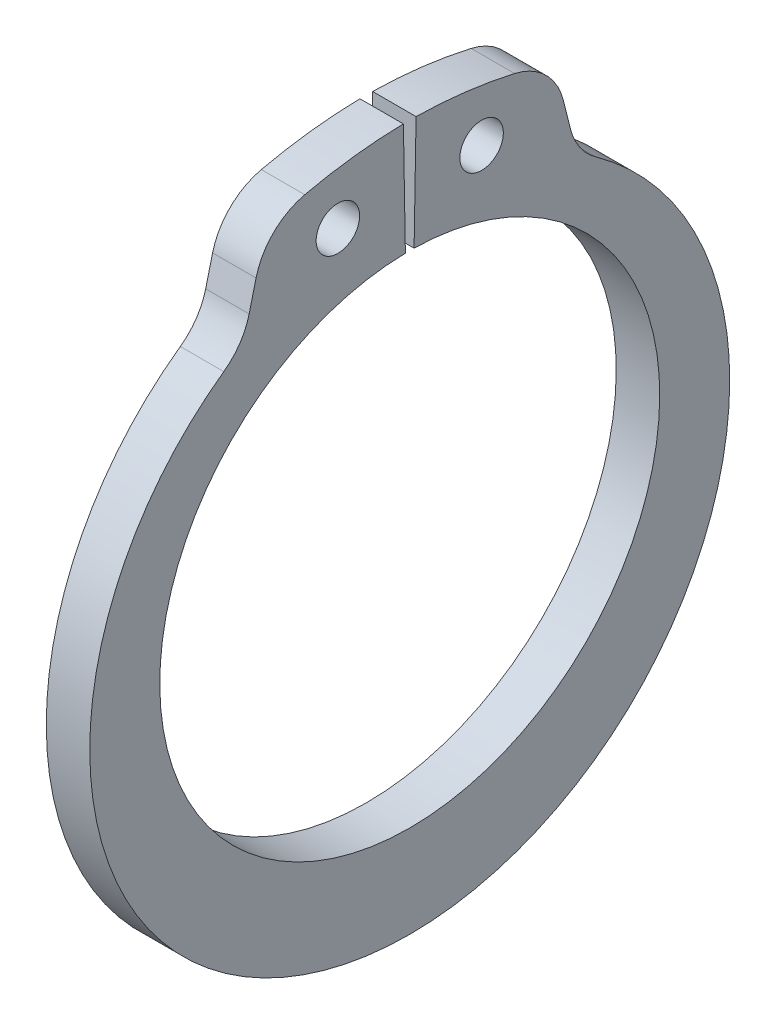
ISO-10303-21;
HEADER;
FILE_DESCRIPTION(('STEP AP214'),'2;1');
FILE_NAME('part.step','',(''),(''),'','','');
FILE_SCHEMA(('AUTOMOTIVE_DESIGN { 1 0 10303 214 1 1 1 1 }'));
ENDSEC;
DATA;
#1=APPLICATION_CONTEXT('core data for automotive mechanical design processes');
#2=APPLICATION_PROTOCOL_DEFINITION('international standard','automotive_design',2000,#1);
#3=PRODUCT_CONTEXT('',#1,'mechanical');
#4=PRODUCT('Part','Part','',(#3));
#5=PRODUCT_RELATED_PRODUCT_CATEGORY('part','',(#4));
#6=PRODUCT_DEFINITION_FORMATION('','',#4);
#7=PRODUCT_DEFINITION_CONTEXT('part definition',#1,'design');
#8=PRODUCT_DEFINITION('design','',#6,#7);
#9=PRODUCT_DEFINITION_SHAPE('','',#8);
#10=(LENGTH_UNIT() NAMED_UNIT(*) SI_UNIT(.MILLI.,.METRE.));
#11=(NAMED_UNIT(*) PLANE_ANGLE_UNIT() SI_UNIT($,.RADIAN.));
#12=(NAMED_UNIT(*) SI_UNIT($,.STERADIAN.) SOLID_ANGLE_UNIT());
#13=UNCERTAINTY_MEASURE_WITH_UNIT(LENGTH_MEASURE(1.E-05),#10,'distance_accuracy_value','');
#14=(GEOMETRIC_REPRESENTATION_CONTEXT(3) GLOBAL_UNCERTAINTY_ASSIGNED_CONTEXT((#13)) GLOBAL_UNIT_ASSIGNED_CONTEXT((#10,
#11,#12)) REPRESENTATION_CONTEXT('',''));
#15=CARTESIAN_POINT('',(0.,0.,0.));
#16=DIRECTION('',(0.,0.,1.));
#17=DIRECTION('',(1.,0.,0.));
#18=AXIS2_PLACEMENT_3D('',#15,#16,#17);
#19=CARTESIAN_POINT('',(0.635,0.,0.));
#20=DIRECTION('',(1.,0.,0.));
#21=DIRECTION('',(0.,0.,-1.));
#22=AXIS2_PLACEMENT_3D('',#19,#20,#21);
#23=PLANE('',#22);
#24=CARTESIAN_POINT('',(0.635,8.91822312671087,2.09914672795182));
#25=DIRECTION('',(1.,0.,0.));
#26=DIRECTION('',(0.,0.,-1.));
#27=AXIS2_PLACEMENT_3D('',#24,#25,#26);
#28=CIRCLE('',#27,0.635);
#29=CARTESIAN_POINT('',(0.635,8.91822312671087,1.46414672795182));
#30=VERTEX_POINT('',#29);
#31=EDGE_CURVE('E219',#30,#30,#28,.T.);
#32=ORIENTED_EDGE('',*,*,#31,.F.);
#33=EDGE_LOOP('',(#32));
#34=FACE_BOUND('',#33,.T.);
#35=CARTESIAN_POINT('',(0.635,-3.4166642590157,-0.0596380964790399));
#36=DIRECTION('',(1.,0.,0.));
#37=DIRECTION('',(0.,0.,-1.));
#38=AXIS2_PLACEMENT_3D('',#35,#36,#37);
#39=CIRCLE('',#38,14.021684712799);
#40=CARTESIAN_POINT('',(0.635,10.6028848832859,0.185074044064174));
#41=VERTEX_POINT('',#40);
#42=CARTESIAN_POINT('',(0.635,10.2522844995259,3.06565901283796));
#43=VERTEX_POINT('',#42);
#44=EDGE_CURVE('E136',#41,#43,#39,.T.);
#45=ORIENTED_EDGE('',*,*,#44,.T.);
#46=CARTESIAN_POINT('',(0.635,8.39520755632137,2.64105304606605));
#47=DIRECTION('',(1.,0.,0.));
#48=DIRECTION('',(0.,0.,-1.));
#49=AXIS2_PLACEMENT_3D('',#46,#47,#48);
#50=CIRCLE('',#49,1.905);
#51=CARTESIAN_POINT('',(0.635,8.85606876743873,4.48946640462183));
#52=VERTEX_POINT('',#51);
#53=EDGE_CURVE('E173',#43,#52,#50,.T.);
#54=ORIENTED_EDGE('',*,*,#53,.T.);
#55=DIRECTION('',(0.,-0.970295726275997,0.241921895599664));
#56=VECTOR('',#55,1.);
#57=CARTESIAN_POINT('',(0.635,9.93587406191388,4.22024070709085));
#58=LINE('',#57,#56);
#59=CARTESIAN_POINT('',(0.635,8.04884426110369,4.69073007863241));
#60=VERTEX_POINT('',#59);
#61=EDGE_CURVE('E211',#52,#60,#58,.T.);
#62=ORIENTED_EDGE('',*,*,#61,.T.);
#63=CARTESIAN_POINT('',(0.635,8.50970547222105,6.53914343718819));
#64=DIRECTION('',(1.,0.,0.));
#65=DIRECTION('',(0.,0.,-1.));
#66=AXIS2_PLACEMENT_3D('',#63,#64,#65);
#67=CIRCLE('',#66,1.905);
#68=CARTESIAN_POINT('',(0.635,6.9594033093494,5.43208056463059));
#69=VERTEX_POINT('',#68);
#70=EDGE_CURVE('E184',#60,#69,#67,.F.);
#71=ORIENTED_EDGE('',*,*,#70,.T.);
#72=CARTESIAN_POINT('',(0.635,-0.647541568843794,0.));
#73=DIRECTION('',(1.,0.,0.));
#74=DIRECTION('',(0.,0.,-1.));
#75=AXIS2_PLACEMENT_3D('',#72,#73,#74);
#76=CIRCLE('',#75,9.34735843115621);
#77=CARTESIAN_POINT('',(0.635,6.95940330934924,-5.4320805646308));
#78=VERTEX_POINT('',#77);
#79=EDGE_CURVE('E206',#69,#78,#76,.T.);
#80=ORIENTED_EDGE('',*,*,#79,.T.);
#81=CARTESIAN_POINT('',(0.635,8.50970547222087,-6.53914343718844));
#82=DIRECTION('',(1.,0.,0.));
#83=DIRECTION('',(0.,0.,-1.));
#84=AXIS2_PLACEMENT_3D('',#81,#82,#83);
#85=CIRCLE('',#84,1.905);
#86=CARTESIAN_POINT('',(0.635,8.0488442611033,-4.69073007863272));
#87=VERTEX_POINT('',#86);
#88=EDGE_CURVE('E11',#78,#87,#85,.F.);
#89=ORIENTED_EDGE('',*,*,#88,.T.);
#90=DIRECTION('',(0.,0.97029572627597,0.241921895599774));
#91=VECTOR('',#90,1.);
#92=CARTESIAN_POINT('',(0.635,9.9358740619139,-4.22024070709083));
#93=LINE('',#92,#91);
#94=CARTESIAN_POINT('',(0.635,8.85606876743885,-4.48946640462191));
#95=VERTEX_POINT('',#94);
#96=EDGE_CURVE('E205',#87,#95,#93,.T.);
#97=ORIENTED_EDGE('',*,*,#96,.T.);
#98=CARTESIAN_POINT('',(0.635,8.39520755632128,-2.64105304606619));
#99=DIRECTION('',(1.,0.,0.));
#100=DIRECTION('',(0.,0.,-1.));
#101=AXIS2_PLACEMENT_3D('',#98,#99,#100);
#102=CIRCLE('',#101,1.905);
#103=CARTESIAN_POINT('',(0.635,10.2522844995258,-3.06565901283805));
#104=VERTEX_POINT('',#103);
#105=EDGE_CURVE('E51',#95,#104,#102,.T.);
#106=ORIENTED_EDGE('',*,*,#105,.T.);
#107=CARTESIAN_POINT('',(0.635,-3.41666425902333,0.0596380964802941));
#108=DIRECTION('',(1.,0.,0.));
#109=DIRECTION('',(0.,0.,1.));
#110=AXIS2_PLACEMENT_3D('',#107,#108,#109);
#111=CIRCLE('',#110,14.0216847128066);
#112=CARTESIAN_POINT('',(0.635,10.6028848832859,-0.185074044064175));
#113=VERTEX_POINT('',#112);
#114=EDGE_CURVE('E208',#104,#113,#111,.T.);
#115=ORIENTED_EDGE('',*,*,#114,.T.);
#116=DIRECTION('',(0.,-0.999847695156391,0.0174524064372837));
#117=VECTOR('',#116,1.);
#118=CARTESIAN_POINT('',(0.635,10.6028848832859,-0.185074044064174));
#119=LINE('',#118,#117);
#120=CARTESIAN_POINT('',(0.635,7.30138779387956,-0.127446198008263));
#121=VERTEX_POINT('',#120);
#122=EDGE_CURVE('E142',#113,#121,#119,.T.);
#123=ORIENTED_EDGE('',*,*,#122,.T.);
#124=CARTESIAN_POINT('',(0.635,0.,0.));
#125=DIRECTION('',(-1.,0.,0.));
#126=DIRECTION('',(0.,0.,-1.));
#127=AXIS2_PLACEMENT_3D('',#124,#125,#126);
#128=CIRCLE('',#127,7.30250000000001);
#129=CARTESIAN_POINT('',(0.635,7.30138779387956,0.127446198008263));
#130=VERTEX_POINT('',#129);
#131=EDGE_CURVE('E137',#121,#130,#128,.T.);
#132=ORIENTED_EDGE('',*,*,#131,.T.);
#133=DIRECTION('',(0.,0.999847695156391,0.0174524064372837));
#134=VECTOR('',#133,1.);
#135=CARTESIAN_POINT('',(0.635,7.30138779387956,0.127446198008263));
#136=LINE('',#135,#134);
#137=EDGE_CURVE('E126',#130,#41,#136,.T.);
#138=ORIENTED_EDGE('',*,*,#137,.T.);
#139=EDGE_LOOP('',(#45,#54,#62,#71,#80,#89,#97,#106,#115,#123,#132,#138));
#140=FACE_BOUND('',#139,.T.);
#141=CARTESIAN_POINT('',(0.635,8.91822312671087,-2.09914672795182));
#142=DIRECTION('',(1.,0.,0.));
#143=DIRECTION('',(0.,0.,-1.));
#144=AXIS2_PLACEMENT_3D('',#141,#142,#143);
#145=CIRCLE('',#144,0.635);
#146=CARTESIAN_POINT('',(0.635,8.91822312671087,-2.73414672795182));
#147=VERTEX_POINT('',#146);
#148=EDGE_CURVE('E248',#147,#147,#145,.T.);
#149=ORIENTED_EDGE('',*,*,#148,.F.);
#150=EDGE_LOOP('',(#149));
#151=FACE_BOUND('',#150,.T.);
#152=ADVANCED_FACE('F36',(#34,#140,#151),#23,.T.);
#153=CARTESIAN_POINT('',(-0.635,0.,0.));
#154=DIRECTION('',(1.,0.,0.));
#155=DIRECTION('',(0.,0.,-1.));
#156=AXIS2_PLACEMENT_3D('',#153,#154,#155);
#157=PLANE('',#156);
#158=CARTESIAN_POINT('',(-0.635,8.91822312671087,2.09914672795182));
#159=DIRECTION('',(1.,0.,0.));
#160=DIRECTION('',(0.,0.,-1.));
#161=AXIS2_PLACEMENT_3D('',#158,#159,#160);
#162=CIRCLE('',#161,0.635);
#163=CARTESIAN_POINT('',(-0.635,8.91822312671087,1.46414672795182));
#164=VERTEX_POINT('',#163);
#165=EDGE_CURVE('E245',#164,#164,#162,.T.);
#166=ORIENTED_EDGE('',*,*,#165,.T.);
#167=EDGE_LOOP('',(#166));
#168=FACE_BOUND('',#167,.T.);
#169=DIRECTION('',(0.,-0.970295726275997,0.241921895599664));
#170=VECTOR('',#169,1.);
#171=CARTESIAN_POINT('',(-0.635,9.93587406191388,4.22024070709085));
#172=LINE('',#171,#170);
#173=CARTESIAN_POINT('',(-0.635,8.85606876743873,4.48946640462183));
#174=VERTEX_POINT('',#173);
#175=CARTESIAN_POINT('',(-0.635,8.04884426110369,4.69073007863241));
#176=VERTEX_POINT('',#175);
#177=EDGE_CURVE('E202',#174,#176,#172,.T.);
#178=ORIENTED_EDGE('',*,*,#177,.F.);
#179=CARTESIAN_POINT('',(-0.635,8.39520755632137,2.64105304606605));
#180=DIRECTION('',(1.,0.,0.));
#181=DIRECTION('',(0.,0.,-1.));
#182=AXIS2_PLACEMENT_3D('',#179,#180,#181);
#183=CIRCLE('',#182,1.905);
#184=CARTESIAN_POINT('',(-0.635,10.2522844995259,3.06565901283796));
#185=VERTEX_POINT('',#184);
#186=EDGE_CURVE('E168',#174,#185,#183,.F.);
#187=ORIENTED_EDGE('',*,*,#186,.T.);
#188=CARTESIAN_POINT('',(-0.635,-3.4166642590157,-0.0596380964790399));
#189=DIRECTION('',(1.,0.,0.));
#190=DIRECTION('',(0.,0.,-1.));
#191=AXIS2_PLACEMENT_3D('',#188,#189,#190);
#192=CIRCLE('',#191,14.021684712799);
#193=CARTESIAN_POINT('',(-0.635,10.6028848832859,0.185074044064174));
#194=VERTEX_POINT('',#193);
#195=EDGE_CURVE('E221',#194,#185,#192,.T.);
#196=ORIENTED_EDGE('',*,*,#195,.F.);
#197=DIRECTION('',(0.,0.999847695156391,0.0174524064372837));
#198=VECTOR('',#197,1.);
#199=CARTESIAN_POINT('',(-0.635,7.30138779387956,0.127446198008263));
#200=LINE('',#199,#198);
#201=CARTESIAN_POINT('',(-0.635,7.30138779387956,0.127446198008263));
#202=VERTEX_POINT('',#201);
#203=EDGE_CURVE('E218',#202,#194,#200,.T.);
#204=ORIENTED_EDGE('',*,*,#203,.F.);
#205=CARTESIAN_POINT('',(-0.635,0.,0.));
#206=DIRECTION('',(-1.,0.,0.));
#207=DIRECTION('',(0.,0.,-1.));
#208=AXIS2_PLACEMENT_3D('',#205,#206,#207);
#209=CIRCLE('',#208,7.30250000000001);
#210=CARTESIAN_POINT('',(-0.635,7.30138779387956,-0.127446198008263));
#211=VERTEX_POINT('',#210);
#212=EDGE_CURVE('E150',#211,#202,#209,.T.);
#213=ORIENTED_EDGE('',*,*,#212,.F.);
#214=DIRECTION('',(0.,-0.999847695156391,0.0174524064372837));
#215=VECTOR('',#214,1.);
#216=CARTESIAN_POINT('',(-0.635,10.6028848832859,-0.185074044064174));
#217=LINE('',#216,#215);
#218=CARTESIAN_POINT('',(-0.635,10.6028848832859,-0.185074044064175));
#219=VERTEX_POINT('',#218);
#220=EDGE_CURVE('E146',#219,#211,#217,.T.);
#221=ORIENTED_EDGE('',*,*,#220,.F.);
#222=CARTESIAN_POINT('',(-0.635,-3.41666425902333,0.0596380964802941));
#223=DIRECTION('',(1.,0.,0.));
#224=DIRECTION('',(0.,0.,1.));
#225=AXIS2_PLACEMENT_3D('',#222,#223,#224);
#226=CIRCLE('',#225,14.0216847128066);
#227=CARTESIAN_POINT('',(-0.635,10.2522844995258,-3.06565901283805));
#228=VERTEX_POINT('',#227);
#229=EDGE_CURVE('E227',#228,#219,#226,.T.);
#230=ORIENTED_EDGE('',*,*,#229,.F.);
#231=CARTESIAN_POINT('',(-0.635,8.39520755632128,-2.64105304606619));
#232=DIRECTION('',(1.,0.,0.));
#233=DIRECTION('',(0.,0.,-1.));
#234=AXIS2_PLACEMENT_3D('',#231,#232,#233);
#235=CIRCLE('',#234,1.905);
#236=CARTESIAN_POINT('',(-0.635,8.85606876743885,-4.48946640462191));
#237=VERTEX_POINT('',#236);
#238=EDGE_CURVE('E166',#228,#237,#235,.F.);
#239=ORIENTED_EDGE('',*,*,#238,.T.);
#240=DIRECTION('',(0.,0.97029572627597,0.241921895599774));
#241=VECTOR('',#240,1.);
#242=CARTESIAN_POINT('',(-0.635,9.9358740619139,-4.22024070709083));
#243=LINE('',#242,#241);
#244=CARTESIAN_POINT('',(-0.635,8.0488442611033,-4.69073007863272));
#245=VERTEX_POINT('',#244);
#246=EDGE_CURVE('E193',#245,#237,#243,.T.);
#247=ORIENTED_EDGE('',*,*,#246,.F.);
#248=CARTESIAN_POINT('',(-0.635,8.50970547222087,-6.53914343718844));
#249=DIRECTION('',(1.,0.,0.));
#250=DIRECTION('',(0.,0.,-1.));
#251=AXIS2_PLACEMENT_3D('',#248,#249,#250);
#252=CIRCLE('',#251,1.905);
#253=CARTESIAN_POINT('',(-0.635,6.95940330934924,-5.4320805646308));
#254=VERTEX_POINT('',#253);
#255=EDGE_CURVE('E44',#245,#254,#252,.T.);
#256=ORIENTED_EDGE('',*,*,#255,.T.);
#257=CARTESIAN_POINT('',(-0.635,-0.647541568843794,0.));
#258=DIRECTION('',(1.,0.,0.));
#259=DIRECTION('',(0.,0.,-1.));
#260=AXIS2_PLACEMENT_3D('',#257,#258,#259);
#261=CIRCLE('',#260,9.34735843115621);
#262=CARTESIAN_POINT('',(-0.635,6.9594033093494,5.43208056463059));
#263=VERTEX_POINT('',#262);
#264=EDGE_CURVE('E192',#263,#254,#261,.T.);
#265=ORIENTED_EDGE('',*,*,#264,.F.);
#266=CARTESIAN_POINT('',(-0.635,8.50970547222105,6.53914343718819));
#267=DIRECTION('',(1.,0.,0.));
#268=DIRECTION('',(0.,0.,-1.));
#269=AXIS2_PLACEMENT_3D('',#266,#267,#268);
#270=CIRCLE('',#269,1.905);
#271=EDGE_CURVE('E182',#263,#176,#270,.T.);
#272=ORIENTED_EDGE('',*,*,#271,.T.);
#273=EDGE_LOOP('',(#178,#187,#196,#204,#213,#221,#230,#239,#247,#256,#265,#272));
#274=FACE_BOUND('',#273,.T.);
#275=CARTESIAN_POINT('',(-0.635,8.91822312671087,-2.09914672795182));
#276=DIRECTION('',(1.,0.,0.));
#277=DIRECTION('',(0.,0.,-1.));
#278=AXIS2_PLACEMENT_3D('',#275,#276,#277);
#279=CIRCLE('',#278,0.635);
#280=CARTESIAN_POINT('',(-0.635,8.91822312671087,-2.73414672795182));
#281=VERTEX_POINT('',#280);
#282=EDGE_CURVE('E251',#281,#281,#279,.T.);
#283=ORIENTED_EDGE('',*,*,#282,.T.);
#284=EDGE_LOOP('',(#283));
#285=FACE_BOUND('',#284,.T.);
#286=ADVANCED_FACE('F190',(#168,#274,#285),#157,.F.);
#287=CARTESIAN_POINT('',(0.635,0.,0.));
#288=DIRECTION('',(-1.,0.,0.));
#289=DIRECTION('',(0.,0.,1.));
#290=AXIS2_PLACEMENT_3D('',#287,#288,#289);
#291=CYLINDRICAL_SURFACE('',#290,7.30250000000001);
#292=ORIENTED_EDGE('',*,*,#212,.T.);
#293=DIRECTION('',(-1.,0.,0.));
#294=VECTOR('',#293,1.);
#295=CARTESIAN_POINT('',(0.635,7.30138779387956,0.127446198008263));
#296=LINE('',#295,#294);
#297=EDGE_CURVE('E130',#130,#202,#296,.T.);
#298=ORIENTED_EDGE('',*,*,#297,.F.);
#299=ORIENTED_EDGE('',*,*,#131,.F.);
#300=DIRECTION('',(-1.,0.,0.));
#301=VECTOR('',#300,1.);
#302=CARTESIAN_POINT('',(0.635,7.30138779387956,-0.127446198008263));
#303=LINE('',#302,#301);
#304=EDGE_CURVE('E216',#121,#211,#303,.T.);
#305=ORIENTED_EDGE('',*,*,#304,.T.);
#306=EDGE_LOOP('',(#292,#298,#299,#305));
#307=FACE_BOUND('',#306,.T.);
#308=ADVANCED_FACE('F148',(#307),#291,.F.);
#309=CARTESIAN_POINT('',(0.635,7.30138779387956,0.127446198008263));
#310=DIRECTION('',(0.,-0.0174524064372837,0.999847695156391));
#311=DIRECTION('',(0.,-0.999847695156391,-0.0174524064372837));
#312=AXIS2_PLACEMENT_3D('',#309,#310,#311);
#313=PLANE('',#312);
#314=ORIENTED_EDGE('',*,*,#203,.T.);
#315=DIRECTION('',(-1.,0.,0.));
#316=VECTOR('',#315,1.);
#317=CARTESIAN_POINT('',(0.635,10.6028848832859,0.185074044064174));
#318=LINE('',#317,#316);
#319=EDGE_CURVE('E133',#41,#194,#318,.T.);
#320=ORIENTED_EDGE('',*,*,#319,.F.);
#321=ORIENTED_EDGE('',*,*,#137,.F.);
#322=ORIENTED_EDGE('',*,*,#297,.T.);
#323=EDGE_LOOP('',(#314,#320,#321,#322));
#324=FACE_BOUND('',#323,.T.);
#325=ADVANCED_FACE('F128',(#324),#313,.F.);
#326=CARTESIAN_POINT('',(0.635,-3.4166642590157,-0.0596380964790399));
#327=DIRECTION('',(-1.,0.,0.));
#328=DIRECTION('',(0.,0.,1.));
#329=AXIS2_PLACEMENT_3D('',#326,#327,#328);
#330=CYLINDRICAL_SURFACE('',#329,14.021684712799);
#331=ORIENTED_EDGE('',*,*,#195,.T.);
#332=DIRECTION('',(-1.,0.,0.));
#333=VECTOR('',#332,1.);
#334=CARTESIAN_POINT('',(0.635,10.2522844995259,3.06565901283796));
#335=LINE('',#334,#333);
#336=EDGE_CURVE('E170',#185,#43,#335,.F.);
#337=ORIENTED_EDGE('',*,*,#336,.T.);
#338=ORIENTED_EDGE('',*,*,#44,.F.);
#339=ORIENTED_EDGE('',*,*,#319,.T.);
#340=EDGE_LOOP('',(#331,#337,#338,#339));
#341=FACE_BOUND('',#340,.T.);
#342=ADVANCED_FACE('F239',(#341),#330,.T.);
#343=CARTESIAN_POINT('',(0.635,9.93587406191388,4.22024070709085));
#344=DIRECTION('',(0.,-0.241921895599664,-0.970295726275997));
#345=DIRECTION('',(0.,0.970295726275998,-0.241921895599664));
#346=AXIS2_PLACEMENT_3D('',#343,#344,#345);
#347=PLANE('',#346);
#348=ORIENTED_EDGE('',*,*,#177,.T.);
#349=DIRECTION('',(1.,0.,0.));
#350=VECTOR('',#349,1.);
#351=CARTESIAN_POINT('',(0.635,8.04884426110369,4.69073007863241));
#352=LINE('',#351,#350);
#353=EDGE_CURVE('E164',#176,#60,#352,.T.);
#354=ORIENTED_EDGE('',*,*,#353,.T.);
#355=ORIENTED_EDGE('',*,*,#61,.F.);
#356=DIRECTION('',(-1.,0.,0.));
#357=VECTOR('',#356,1.);
#358=CARTESIAN_POINT('',(0.635,8.85606876743873,4.48946640462183));
#359=LINE('',#358,#357);
#360=EDGE_CURVE('E161',#52,#174,#359,.T.);
#361=ORIENTED_EDGE('',*,*,#360,.T.);
#362=EDGE_LOOP('',(#348,#354,#355,#361));
#363=FACE_BOUND('',#362,.T.);
#364=ADVANCED_FACE('F281',(#363),#347,.F.);
#365=CARTESIAN_POINT('',(0.635,-0.647541568843794,0.));
#366=DIRECTION('',(-1.,0.,0.));
#367=DIRECTION('',(0.,0.,1.));
#368=AXIS2_PLACEMENT_3D('',#365,#366,#367);
#369=CYLINDRICAL_SURFACE('',#368,9.34735843115621);
#370=ORIENTED_EDGE('',*,*,#79,.F.);
#371=DIRECTION('',(-1.,0.,0.));
#372=VECTOR('',#371,1.);
#373=CARTESIAN_POINT('',(0.635,6.9594033093494,5.43208056463059));
#374=LINE('',#373,#372);
#375=EDGE_CURVE('E153',#69,#263,#374,.T.);
#376=ORIENTED_EDGE('',*,*,#375,.T.);
#377=ORIENTED_EDGE('',*,*,#264,.T.);
#378=DIRECTION('',(-1.,0.,0.));
#379=VECTOR('',#378,1.);
#380=CARTESIAN_POINT('',(0.635,6.95940330934925,-5.4320805646308));
#381=LINE('',#380,#379);
#382=EDGE_CURVE('E151',#254,#78,#381,.F.);
#383=ORIENTED_EDGE('',*,*,#382,.T.);
#384=EDGE_LOOP('',(#370,#376,#377,#383));
#385=FACE_BOUND('',#384,.T.);
#386=ADVANCED_FACE('F199',(#385),#369,.T.);
#387=CARTESIAN_POINT('',(0.635,9.9358740619139,-4.22024070709083));
#388=DIRECTION('',(0.,-0.241921895599774,0.97029572627597));
#389=DIRECTION('',(0.,-0.97029572627597,-0.241921895599774));
#390=AXIS2_PLACEMENT_3D('',#387,#388,#389);
#391=PLANE('',#390);
#392=ORIENTED_EDGE('',*,*,#246,.T.);
#393=DIRECTION('',(-1.,0.,0.));
#394=VECTOR('',#393,1.);
#395=CARTESIAN_POINT('',(0.635,8.85606876743885,-4.48946640462191));
#396=LINE('',#395,#394);
#397=EDGE_CURVE('E59',#237,#95,#396,.F.);
#398=ORIENTED_EDGE('',*,*,#397,.T.);
#399=ORIENTED_EDGE('',*,*,#96,.F.);
#400=DIRECTION('',(1.,0.,0.));
#401=VECTOR('',#400,1.);
#402=CARTESIAN_POINT('',(-0.635,8.0488442611033,-4.69073007863272));
#403=LINE('',#402,#401);
#404=EDGE_CURVE('E178',#87,#245,#403,.F.);
#405=ORIENTED_EDGE('',*,*,#404,.T.);
#406=EDGE_LOOP('',(#392,#398,#399,#405));
#407=FACE_BOUND('',#406,.T.);
#408=ADVANCED_FACE('F207',(#407),#391,.F.);
#409=CARTESIAN_POINT('',(0.635,-3.41666425902333,0.0596380964802941));
#410=DIRECTION('',(-1.,0.,0.));
#411=DIRECTION('',(0.,0.,1.));
#412=AXIS2_PLACEMENT_3D('',#409,#410,#411);
#413=CYLINDRICAL_SURFACE('',#412,14.0216847128066);
#414=ORIENTED_EDGE('',*,*,#114,.F.);
#415=DIRECTION('',(-1.,0.,0.));
#416=VECTOR('',#415,1.);
#417=CARTESIAN_POINT('',(0.635,10.2522844995258,-3.06565901283805));
#418=LINE('',#417,#416);
#419=EDGE_CURVE('E175',#104,#228,#418,.T.);
#420=ORIENTED_EDGE('',*,*,#419,.T.);
#421=ORIENTED_EDGE('',*,*,#229,.T.);
#422=DIRECTION('',(-1.,0.,0.));
#423=VECTOR('',#422,1.);
#424=CARTESIAN_POINT('',(0.635,10.6028848832859,-0.185074044064175));
#425=LINE('',#424,#423);
#426=EDGE_CURVE('E155',#113,#219,#425,.T.);
#427=ORIENTED_EDGE('',*,*,#426,.F.);
#428=EDGE_LOOP('',(#414,#420,#421,#427));
#429=FACE_BOUND('',#428,.T.);
#430=ADVANCED_FACE('F274',(#429),#413,.T.);
#431=CARTESIAN_POINT('',(0.635,10.6028848832859,-0.185074044064174));
#432=DIRECTION('',(0.,-0.0174524064372837,-0.999847695156391));
#433=DIRECTION('',(0.,0.999847695156391,-0.0174524064372837));
#434=AXIS2_PLACEMENT_3D('',#431,#432,#433);
#435=PLANE('',#434);
#436=ORIENTED_EDGE('',*,*,#220,.T.);
#437=ORIENTED_EDGE('',*,*,#304,.F.);
#438=ORIENTED_EDGE('',*,*,#122,.F.);
#439=ORIENTED_EDGE('',*,*,#426,.T.);
#440=EDGE_LOOP('',(#436,#437,#438,#439));
#441=FACE_BOUND('',#440,.T.);
#442=ADVANCED_FACE('F234',(#441),#435,.F.);
#443=CARTESIAN_POINT('',(0.635,8.91822312671087,2.09914672795182));
#444=DIRECTION('',(-1.,0.,0.));
#445=DIRECTION('',(0.,0.,1.));
#446=AXIS2_PLACEMENT_3D('',#443,#444,#445);
#447=CYLINDRICAL_SURFACE('',#446,0.635);
#448=ORIENTED_EDGE('',*,*,#31,.T.);
#449=EDGE_LOOP('',(#448));
#450=FACE_BOUND('',#449,.T.);
#451=ORIENTED_EDGE('',*,*,#165,.F.);
#452=EDGE_LOOP('',(#451));
#453=FACE_BOUND('',#452,.T.);
#454=ADVANCED_FACE('F269',(#450,#453),#447,.F.);
#455=CARTESIAN_POINT('',(0.635,8.91822312671087,-2.09914672795182));
#456=DIRECTION('',(-1.,0.,0.));
#457=DIRECTION('',(0.,0.,1.));
#458=AXIS2_PLACEMENT_3D('',#455,#456,#457);
#459=CYLINDRICAL_SURFACE('',#458,0.635);
#460=ORIENTED_EDGE('',*,*,#148,.T.);
#461=EDGE_LOOP('',(#460));
#462=FACE_BOUND('',#461,.T.);
#463=ORIENTED_EDGE('',*,*,#282,.F.);
#464=EDGE_LOOP('',(#463));
#465=FACE_BOUND('',#464,.T.);
#466=ADVANCED_FACE('F257',(#462,#465),#459,.F.);
#467=CARTESIAN_POINT('',(0.635,8.50970547222105,6.53914343718819));
#468=DIRECTION('',(-1.,0.,0.));
#469=DIRECTION('',(0.,0.,1.));
#470=AXIS2_PLACEMENT_3D('',#467,#468,#469);
#471=CYLINDRICAL_SURFACE('',#470,1.905);
#472=ORIENTED_EDGE('',*,*,#70,.F.);
#473=ORIENTED_EDGE('',*,*,#353,.F.);
#474=ORIENTED_EDGE('',*,*,#271,.F.);
#475=ORIENTED_EDGE('',*,*,#375,.F.);
#476=EDGE_LOOP('',(#472,#473,#474,#475));
#477=FACE_BOUND('',#476,.T.);
#478=ADVANCED_FACE('F291',(#477),#471,.F.);
#479=CARTESIAN_POINT('',(0.635,8.39520755632137,2.64105304606605));
#480=DIRECTION('',(-1.,0.,0.));
#481=DIRECTION('',(0.,0.,1.));
#482=AXIS2_PLACEMENT_3D('',#479,#480,#481);
#483=CYLINDRICAL_SURFACE('',#482,1.905);
#484=ORIENTED_EDGE('',*,*,#53,.F.);
#485=ORIENTED_EDGE('',*,*,#336,.F.);
#486=ORIENTED_EDGE('',*,*,#186,.F.);
#487=ORIENTED_EDGE('',*,*,#360,.F.);
#488=EDGE_LOOP('',(#484,#485,#486,#487));
#489=FACE_BOUND('',#488,.T.);
#490=ADVANCED_FACE('F294',(#489),#483,.T.);
#491=CARTESIAN_POINT('',(0.635,8.39520755632128,-2.64105304606619));
#492=DIRECTION('',(-1.,0.,0.));
#493=DIRECTION('',(0.,0.,1.));
#494=AXIS2_PLACEMENT_3D('',#491,#492,#493);
#495=CYLINDRICAL_SURFACE('',#494,1.905);
#496=ORIENTED_EDGE('',*,*,#105,.F.);
#497=ORIENTED_EDGE('',*,*,#397,.F.);
#498=ORIENTED_EDGE('',*,*,#238,.F.);
#499=ORIENTED_EDGE('',*,*,#419,.F.);
#500=EDGE_LOOP('',(#496,#497,#498,#499));
#501=FACE_BOUND('',#500,.T.);
#502=ADVANCED_FACE('F297',(#501),#495,.T.);
#503=CARTESIAN_POINT('',(0.635,8.50970547222087,-6.53914343718844));
#504=DIRECTION('',(-1.,0.,0.));
#505=DIRECTION('',(0.,0.,1.));
#506=AXIS2_PLACEMENT_3D('',#503,#504,#505);
#507=CYLINDRICAL_SURFACE('',#506,1.905);
#508=ORIENTED_EDGE('',*,*,#88,.F.);
#509=ORIENTED_EDGE('',*,*,#382,.F.);
#510=ORIENTED_EDGE('',*,*,#255,.F.);
#511=ORIENTED_EDGE('',*,*,#404,.F.);
#512=EDGE_LOOP('',(#508,#509,#510,#511));
#513=FACE_BOUND('',#512,.T.);
#514=ADVANCED_FACE('F38',(#513),#507,.F.);
#515=CLOSED_SHELL('',(#152,#286,#308,#325,#342,#364,#386,#408,#430,#442,#454,#466,#478,#490,
#502,#514));
#516=MANIFOLD_SOLID_BREP('B2',#515);
#517=ADVANCED_BREP_SHAPE_REPRESENTATION('',(#18,#516),#14);
#518=SHAPE_DEFINITION_REPRESENTATION(#9,#517);
ENDSEC;
END-ISO-10303-21;
